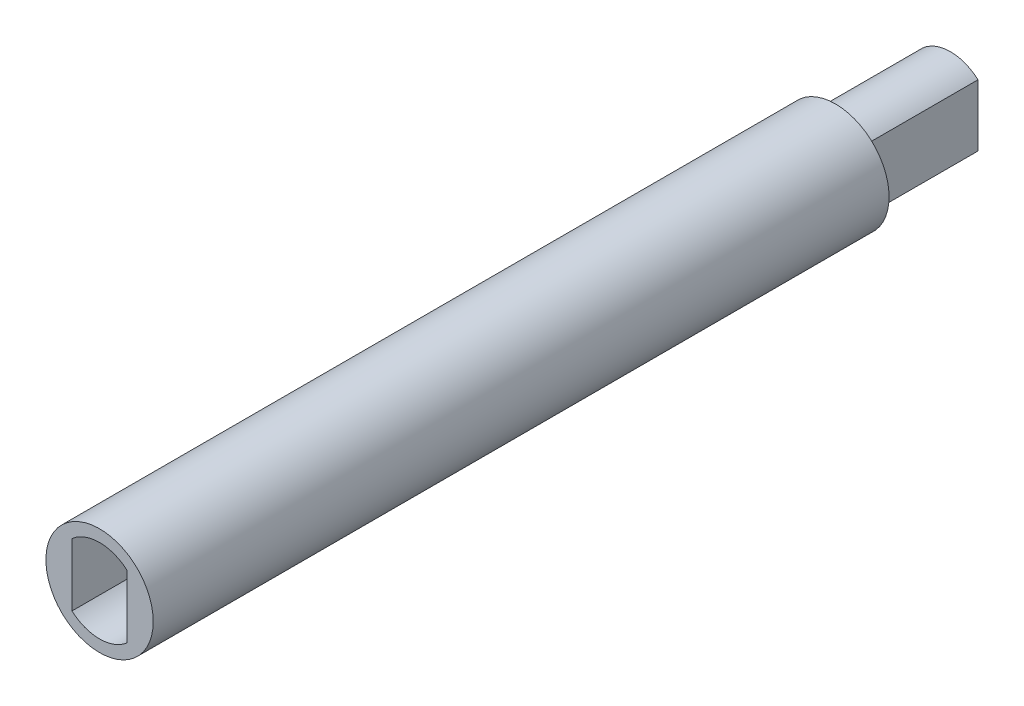
ISO-10303-21;
HEADER;
FILE_DESCRIPTION(('STEP AP214'),'2;1');
FILE_NAME('part.step','',(''),(''),'','','');
FILE_SCHEMA(('AUTOMOTIVE_DESIGN { 1 0 10303 214 1 1 1 1 }'));
ENDSEC;
DATA;
#1=APPLICATION_CONTEXT('core data for automotive mechanical design processes');
#2=APPLICATION_PROTOCOL_DEFINITION('international standard','automotive_design',2000,#1);
#3=PRODUCT_CONTEXT('',#1,'mechanical');
#4=PRODUCT('Part','Part','',(#3));
#5=PRODUCT_RELATED_PRODUCT_CATEGORY('part','',(#4));
#6=PRODUCT_DEFINITION_FORMATION('','',#4);
#7=PRODUCT_DEFINITION_CONTEXT('part definition',#1,'design');
#8=PRODUCT_DEFINITION('design','',#6,#7);
#9=PRODUCT_DEFINITION_SHAPE('','',#8);
#10=(LENGTH_UNIT() NAMED_UNIT(*) SI_UNIT(.MILLI.,.METRE.));
#11=(NAMED_UNIT(*) PLANE_ANGLE_UNIT() SI_UNIT($,.RADIAN.));
#12=(NAMED_UNIT(*) SI_UNIT($,.STERADIAN.) SOLID_ANGLE_UNIT());
#13=UNCERTAINTY_MEASURE_WITH_UNIT(LENGTH_MEASURE(1.E-05),#10,'distance_accuracy_value','');
#14=(GEOMETRIC_REPRESENTATION_CONTEXT(3) GLOBAL_UNCERTAINTY_ASSIGNED_CONTEXT((#13)) GLOBAL_UNIT_ASSIGNED_CONTEXT((#10,
#11,#12)) REPRESENTATION_CONTEXT('',''));
#15=CARTESIAN_POINT('',(0.,0.,0.));
#16=DIRECTION('',(0.,0.,1.));
#17=DIRECTION('',(1.,0.,0.));
#18=AXIS2_PLACEMENT_3D('',#15,#16,#17);
#19=CARTESIAN_POINT('',(-1.8,0.,-45.5));
#20=DIRECTION('',(1.,0.,0.));
#21=DIRECTION('',(0.,0.,-1.));
#22=AXIS2_PLACEMENT_3D('',#19,#20,#21);
#23=PLANE('',#22);
#24=DIRECTION('',(0.,1.,0.));
#25=VECTOR('',#24,1.);
#26=CARTESIAN_POINT('',(-1.8,4.20472197600874,-53.));
#27=LINE('',#26,#25);
#28=CARTESIAN_POINT('',(-1.8,-2.01246117974981,-53.));
#29=VERTEX_POINT('',#28);
#30=CARTESIAN_POINT('',(-1.8,2.01246117974981,-53.));
#31=VERTEX_POINT('',#30);
#32=EDGE_CURVE('E131',#29,#31,#27,.T.);
#33=ORIENTED_EDGE('',*,*,#32,.F.);
#34=DIRECTION('',(0.,0.,-1.));
#35=VECTOR('',#34,1.);
#36=CARTESIAN_POINT('',(-1.8,-2.01246117974981,-45.5));
#37=LINE('',#36,#35);
#38=CARTESIAN_POINT('',(-1.8,-2.01246117974981,-45.5));
#39=VERTEX_POINT('',#38);
#40=EDGE_CURVE('E159',#39,#29,#37,.T.);
#41=ORIENTED_EDGE('',*,*,#40,.F.);
#42=DIRECTION('',(0.,-1.,0.));
#43=VECTOR('',#42,1.);
#44=CARTESIAN_POINT('',(-1.8,0.,-45.5));
#45=LINE('',#44,#43);
#46=CARTESIAN_POINT('',(-1.8,2.01246117974981,-45.5));
#47=VERTEX_POINT('',#46);
#48=EDGE_CURVE('E136',#47,#39,#45,.T.);
#49=ORIENTED_EDGE('',*,*,#48,.F.);
#50=DIRECTION('',(0.,0.,-1.));
#51=VECTOR('',#50,1.);
#52=CARTESIAN_POINT('',(-1.8,2.01246117974981,-45.5));
#53=LINE('',#52,#51);
#54=EDGE_CURVE('E148',#47,#31,#53,.T.);
#55=ORIENTED_EDGE('',*,*,#54,.T.);
#56=EDGE_LOOP('',(#33,#41,#49,#55));
#57=FACE_BOUND('',#56,.T.);
#58=ADVANCED_FACE('F39',(#57),#23,.F.);
#59=CARTESIAN_POINT('',(0.,0.,-65.5));
#60=DIRECTION('',(0.,0.,1.));
#61=DIRECTION('',(1.,0.,0.));
#62=AXIS2_PLACEMENT_3D('',#59,#60,#61);
#63=CYLINDRICAL_SURFACE('',#62,3.5);
#64=CARTESIAN_POINT('',(0.,0.,-45.5));
#65=DIRECTION('',(0.,0.,-1.));
#66=DIRECTION('',(-1.,0.,0.));
#67=AXIS2_PLACEMENT_3D('',#64,#65,#66);
#68=CIRCLE('',#67,3.5);
#69=CARTESIAN_POINT('',(-3.5,0.,-45.5));
#70=VERTEX_POINT('',#69);
#71=EDGE_CURVE('E149',#70,#70,#68,.T.);
#72=ORIENTED_EDGE('',*,*,#71,.F.);
#73=EDGE_LOOP('',(#72));
#74=FACE_BOUND('',#73,.T.);
#75=CARTESIAN_POINT('',(0.,0.,2.5));
#76=DIRECTION('',(0.,0.,1.));
#77=DIRECTION('',(1.,0.,0.));
#78=AXIS2_PLACEMENT_3D('',#75,#76,#77);
#79=CIRCLE('',#78,3.5);
#80=CARTESIAN_POINT('',(3.5,0.,2.5));
#81=VERTEX_POINT('',#80);
#82=EDGE_CURVE('E130',#81,#81,#79,.T.);
#83=ORIENTED_EDGE('',*,*,#82,.F.);
#84=EDGE_LOOP('',(#83));
#85=FACE_BOUND('',#84,.T.);
#86=ADVANCED_FACE('F41',(#74,#85),#63,.T.);
#87=CARTESIAN_POINT('',(0.,0.,-45.5));
#88=DIRECTION('',(0.,0.,-1.));
#89=DIRECTION('',(-1.,0.,0.));
#90=AXIS2_PLACEMENT_3D('',#87,#88,#89);
#91=CYLINDRICAL_SURFACE('',#90,2.7);
#92=CARTESIAN_POINT('',(0.,0.,-53.));
#93=DIRECTION('',(0.,0.,1.));
#94=DIRECTION('',(1.,0.,0.));
#95=AXIS2_PLACEMENT_3D('',#92,#93,#94);
#96=CIRCLE('',#95,2.7);
#97=CARTESIAN_POINT('',(1.8,2.01246117974981,-53.));
#98=VERTEX_POINT('',#97);
#99=EDGE_CURVE('E132',#31,#98,#96,.F.);
#100=ORIENTED_EDGE('',*,*,#99,.F.);
#101=ORIENTED_EDGE('',*,*,#54,.F.);
#102=CARTESIAN_POINT('',(0.,0.,-45.5));
#103=DIRECTION('',(0.,0.,-1.));
#104=DIRECTION('',(-1.,0.,0.));
#105=AXIS2_PLACEMENT_3D('',#102,#103,#104);
#106=CIRCLE('',#105,2.7);
#107=CARTESIAN_POINT('',(1.8,2.01246117974981,-45.5));
#108=VERTEX_POINT('',#107);
#109=EDGE_CURVE('E137',#47,#108,#106,.T.);
#110=ORIENTED_EDGE('',*,*,#109,.T.);
#111=DIRECTION('',(0.,0.,-1.));
#112=VECTOR('',#111,1.);
#113=CARTESIAN_POINT('',(1.8,2.01246117974981,-45.5));
#114=LINE('',#113,#112);
#115=EDGE_CURVE('E147',#108,#98,#114,.T.);
#116=ORIENTED_EDGE('',*,*,#115,.T.);
#117=EDGE_LOOP('',(#100,#101,#110,#116));
#118=FACE_BOUND('',#117,.T.);
#119=ADVANCED_FACE('F197',(#118),#91,.T.);
#120=CARTESIAN_POINT('',(1.8,0.,-45.5));
#121=DIRECTION('',(1.,0.,0.));
#122=DIRECTION('',(0.,0.,-1.));
#123=AXIS2_PLACEMENT_3D('',#120,#121,#122);
#124=PLANE('',#123);
#125=DIRECTION('',(0.,-1.,0.));
#126=VECTOR('',#125,1.);
#127=CARTESIAN_POINT('',(1.8,0.,-53.));
#128=LINE('',#127,#126);
#129=CARTESIAN_POINT('',(1.8,-2.01246117974981,-53.));
#130=VERTEX_POINT('',#129);
#131=EDGE_CURVE('E52',#98,#130,#128,.T.);
#132=ORIENTED_EDGE('',*,*,#131,.F.);
#133=ORIENTED_EDGE('',*,*,#115,.F.);
#134=DIRECTION('',(0.,-1.,0.));
#135=VECTOR('',#134,1.);
#136=CARTESIAN_POINT('',(1.8,0.,-45.5));
#137=LINE('',#136,#135);
#138=CARTESIAN_POINT('',(1.8,-2.01246117974981,-45.5));
#139=VERTEX_POINT('',#138);
#140=EDGE_CURVE('E144',#108,#139,#137,.T.);
#141=ORIENTED_EDGE('',*,*,#140,.T.);
#142=DIRECTION('',(0.,0.,-1.));
#143=VECTOR('',#142,1.);
#144=CARTESIAN_POINT('',(1.8,-2.01246117974981,-45.5));
#145=LINE('',#144,#143);
#146=EDGE_CURVE('E152',#139,#130,#145,.T.);
#147=ORIENTED_EDGE('',*,*,#146,.T.);
#148=EDGE_LOOP('',(#132,#133,#141,#147));
#149=FACE_BOUND('',#148,.T.);
#150=ADVANCED_FACE('F203',(#149),#124,.T.);
#151=CARTESIAN_POINT('',(0.,0.,-45.5));
#152=DIRECTION('',(0.,0.,-1.));
#153=DIRECTION('',(-1.,0.,0.));
#154=AXIS2_PLACEMENT_3D('',#151,#152,#153);
#155=CYLINDRICAL_SURFACE('',#154,2.7);
#156=CARTESIAN_POINT('',(0.,0.,-53.));
#157=DIRECTION('',(0.,0.,1.));
#158=DIRECTION('',(1.,0.,0.));
#159=AXIS2_PLACEMENT_3D('',#156,#157,#158);
#160=CIRCLE('',#159,2.7);
#161=EDGE_CURVE('E11',#130,#29,#160,.F.);
#162=ORIENTED_EDGE('',*,*,#161,.F.);
#163=ORIENTED_EDGE('',*,*,#146,.F.);
#164=CARTESIAN_POINT('',(0.,0.,-45.5));
#165=DIRECTION('',(0.,0.,-1.));
#166=DIRECTION('',(-1.,0.,0.));
#167=AXIS2_PLACEMENT_3D('',#164,#165,#166);
#168=CIRCLE('',#167,2.7);
#169=EDGE_CURVE('E145',#139,#39,#168,.T.);
#170=ORIENTED_EDGE('',*,*,#169,.T.);
#171=ORIENTED_EDGE('',*,*,#40,.T.);
#172=EDGE_LOOP('',(#162,#163,#170,#171));
#173=FACE_BOUND('',#172,.T.);
#174=ADVANCED_FACE('F205',(#173),#155,.T.);
#175=CARTESIAN_POINT('',(0.,0.,-45.5));
#176=DIRECTION('',(0.,0.,-1.));
#177=DIRECTION('',(-1.,0.,0.));
#178=AXIS2_PLACEMENT_3D('',#175,#176,#177);
#179=PLANE('',#178);
#180=ORIENTED_EDGE('',*,*,#109,.F.);
#181=ORIENTED_EDGE('',*,*,#48,.T.);
#182=ORIENTED_EDGE('',*,*,#169,.F.);
#183=ORIENTED_EDGE('',*,*,#140,.F.);
#184=EDGE_LOOP('',(#180,#181,#182,#183));
#185=FACE_BOUND('',#184,.T.);
#186=ORIENTED_EDGE('',*,*,#71,.T.);
#187=EDGE_LOOP('',(#186));
#188=FACE_BOUND('',#187,.T.);
#189=ADVANCED_FACE('F218',(#185,#188),#179,.T.);
#190=CARTESIAN_POINT('',(8.2,4.20472197600874,-53.));
#191=DIRECTION('',(0.,0.,1.));
#192=DIRECTION('',(1.,0.,0.));
#193=AXIS2_PLACEMENT_3D('',#190,#191,#192);
#194=PLANE('',#193);
#195=ORIENTED_EDGE('',*,*,#99,.T.);
#196=ORIENTED_EDGE('',*,*,#131,.T.);
#197=ORIENTED_EDGE('',*,*,#161,.T.);
#198=ORIENTED_EDGE('',*,*,#32,.T.);
#199=EDGE_LOOP('',(#195,#196,#197,#198));
#200=FACE_BOUND('',#199,.T.);
#201=ADVANCED_FACE('F190',(#200),#194,.F.);
#202=CARTESIAN_POINT('',(0.,0.,2.5));
#203=DIRECTION('',(0.,0.,1.));
#204=DIRECTION('',(1.,0.,0.));
#205=AXIS2_PLACEMENT_3D('',#202,#203,#204);
#206=PLANE('',#205);
#207=ORIENTED_EDGE('',*,*,#82,.T.);
#208=EDGE_LOOP('',(#207));
#209=FACE_BOUND('',#208,.T.);
#210=DIRECTION('',(0.,-1.,0.));
#211=VECTOR('',#210,1.);
#212=CARTESIAN_POINT('',(-1.8,2.04588000625648,2.5));
#213=LINE('',#212,#211);
#214=CARTESIAN_POINT('',(-1.8,2.04588000625648,2.5));
#215=VERTEX_POINT('',#214);
#216=CARTESIAN_POINT('',(-1.8,-2.04588000625648,2.5));
#217=VERTEX_POINT('',#216);
#218=EDGE_CURVE('E104',#215,#217,#213,.T.);
#219=ORIENTED_EDGE('',*,*,#218,.F.);
#220=CARTESIAN_POINT('',(0.,0.,2.5));
#221=DIRECTION('',(0.,0.,1.));
#222=DIRECTION('',(1.,0.,0.));
#223=AXIS2_PLACEMENT_3D('',#220,#221,#222);
#224=CIRCLE('',#223,2.725);
#225=CARTESIAN_POINT('',(1.8,2.04588000625648,2.5));
#226=VERTEX_POINT('',#225);
#227=EDGE_CURVE('E112',#226,#215,#224,.T.);
#228=ORIENTED_EDGE('',*,*,#227,.F.);
#229=DIRECTION('',(0.,1.,0.));
#230=VECTOR('',#229,1.);
#231=CARTESIAN_POINT('',(1.8,2.04588000625648,2.5));
#232=LINE('',#231,#230);
#233=CARTESIAN_POINT('',(1.8,-2.04588000625648,2.5));
#234=VERTEX_POINT('',#233);
#235=EDGE_CURVE('E121',#234,#226,#232,.T.);
#236=ORIENTED_EDGE('',*,*,#235,.F.);
#237=CARTESIAN_POINT('',(0.,0.,2.5));
#238=DIRECTION('',(0.,0.,1.));
#239=DIRECTION('',(1.,0.,0.));
#240=AXIS2_PLACEMENT_3D('',#237,#238,#239);
#241=CIRCLE('',#240,2.725);
#242=EDGE_CURVE('E125',#217,#234,#241,.T.);
#243=ORIENTED_EDGE('',*,*,#242,.F.);
#244=EDGE_LOOP('',(#219,#228,#236,#243));
#245=FACE_BOUND('',#244,.T.);
#246=ADVANCED_FACE('F119',(#209,#245),#206,.T.);
#247=CARTESIAN_POINT('',(0.,0.,-8.));
#248=DIRECTION('',(0.,0.,1.));
#249=DIRECTION('',(1.,0.,0.));
#250=AXIS2_PLACEMENT_3D('',#247,#248,#249);
#251=PLANE('',#250);
#252=CARTESIAN_POINT('',(0.,0.,-8.));
#253=DIRECTION('',(0.,0.,1.));
#254=DIRECTION('',(1.,0.,0.));
#255=AXIS2_PLACEMENT_3D('',#252,#253,#254);
#256=CIRCLE('',#255,2.725);
#257=CARTESIAN_POINT('',(-1.8,-2.04588000625648,-8.));
#258=VERTEX_POINT('',#257);
#259=CARTESIAN_POINT('',(1.8,-2.04588000625648,-8.));
#260=VERTEX_POINT('',#259);
#261=EDGE_CURVE('E153',#258,#260,#256,.T.);
#262=ORIENTED_EDGE('',*,*,#261,.T.);
#263=DIRECTION('',(0.,1.,0.));
#264=VECTOR('',#263,1.);
#265=CARTESIAN_POINT('',(1.8,2.04588000625648,-8.));
#266=LINE('',#265,#264);
#267=CARTESIAN_POINT('',(1.8,2.04588000625648,-8.));
#268=VERTEX_POINT('',#267);
#269=EDGE_CURVE('E165',#260,#268,#266,.T.);
#270=ORIENTED_EDGE('',*,*,#269,.T.);
#271=CARTESIAN_POINT('',(0.,0.,-8.));
#272=DIRECTION('',(0.,0.,1.));
#273=DIRECTION('',(1.,0.,0.));
#274=AXIS2_PLACEMENT_3D('',#271,#272,#273);
#275=CIRCLE('',#274,2.725);
#276=CARTESIAN_POINT('',(-1.8,2.04588000625648,-8.));
#277=VERTEX_POINT('',#276);
#278=EDGE_CURVE('E170',#268,#277,#275,.T.);
#279=ORIENTED_EDGE('',*,*,#278,.T.);
#280=DIRECTION('',(0.,-1.,0.));
#281=VECTOR('',#280,1.);
#282=CARTESIAN_POINT('',(-1.8,2.04588000625648,-8.));
#283=LINE('',#282,#281);
#284=EDGE_CURVE('E110',#277,#258,#283,.T.);
#285=ORIENTED_EDGE('',*,*,#284,.T.);
#286=EDGE_LOOP('',(#262,#270,#279,#285));
#287=FACE_BOUND('',#286,.T.);
#288=ADVANCED_FACE('F178',(#287),#251,.T.);
#289=CARTESIAN_POINT('',(1.8,2.04588000625648,-8.));
#290=DIRECTION('',(1.,0.,0.));
#291=DIRECTION('',(0.,0.,-1.));
#292=AXIS2_PLACEMENT_3D('',#289,#290,#291);
#293=PLANE('',#292);
#294=DIRECTION('',(0.,0.,1.));
#295=VECTOR('',#294,1.);
#296=CARTESIAN_POINT('',(1.8,-2.04588000625648,-8.));
#297=LINE('',#296,#295);
#298=EDGE_CURVE('E167',#260,#234,#297,.T.);
#299=ORIENTED_EDGE('',*,*,#298,.T.);
#300=ORIENTED_EDGE('',*,*,#235,.T.);
#301=DIRECTION('',(0.,0.,1.));
#302=VECTOR('',#301,1.);
#303=CARTESIAN_POINT('',(1.8,2.04588000625648,-8.));
#304=LINE('',#303,#302);
#305=EDGE_CURVE('E111',#268,#226,#304,.T.);
#306=ORIENTED_EDGE('',*,*,#305,.F.);
#307=ORIENTED_EDGE('',*,*,#269,.F.);
#308=EDGE_LOOP('',(#299,#300,#306,#307));
#309=FACE_BOUND('',#308,.T.);
#310=ADVANCED_FACE('F172',(#309),#293,.F.);
#311=CARTESIAN_POINT('',(0.,0.,-8.));
#312=DIRECTION('',(0.,0.,1.));
#313=DIRECTION('',(1.,0.,0.));
#314=AXIS2_PLACEMENT_3D('',#311,#312,#313);
#315=CYLINDRICAL_SURFACE('',#314,2.725);
#316=ORIENTED_EDGE('',*,*,#305,.T.);
#317=ORIENTED_EDGE('',*,*,#227,.T.);
#318=DIRECTION('',(0.,0.,1.));
#319=VECTOR('',#318,1.);
#320=CARTESIAN_POINT('',(-1.8,2.04588000625648,-8.));
#321=LINE('',#320,#319);
#322=EDGE_CURVE('E99',#277,#215,#321,.T.);
#323=ORIENTED_EDGE('',*,*,#322,.F.);
#324=ORIENTED_EDGE('',*,*,#278,.F.);
#325=EDGE_LOOP('',(#316,#317,#323,#324));
#326=FACE_BOUND('',#325,.T.);
#327=ADVANCED_FACE('F114',(#326),#315,.F.);
#328=CARTESIAN_POINT('',(-1.8,2.04588000625648,-8.));
#329=DIRECTION('',(-1.,0.,0.));
#330=DIRECTION('',(0.,0.,1.));
#331=AXIS2_PLACEMENT_3D('',#328,#329,#330);
#332=PLANE('',#331);
#333=ORIENTED_EDGE('',*,*,#322,.T.);
#334=ORIENTED_EDGE('',*,*,#218,.T.);
#335=DIRECTION('',(0.,0.,1.));
#336=VECTOR('',#335,1.);
#337=CARTESIAN_POINT('',(-1.8,-2.04588000625648,-8.));
#338=LINE('',#337,#336);
#339=EDGE_CURVE('E50',#258,#217,#338,.T.);
#340=ORIENTED_EDGE('',*,*,#339,.F.);
#341=ORIENTED_EDGE('',*,*,#284,.F.);
#342=EDGE_LOOP('',(#333,#334,#340,#341));
#343=FACE_BOUND('',#342,.T.);
#344=ADVANCED_FACE('F105',(#343),#332,.F.);
#345=CARTESIAN_POINT('',(0.,0.,-8.));
#346=DIRECTION('',(0.,0.,1.));
#347=DIRECTION('',(1.,0.,0.));
#348=AXIS2_PLACEMENT_3D('',#345,#346,#347);
#349=CYLINDRICAL_SURFACE('',#348,2.725);
#350=ORIENTED_EDGE('',*,*,#339,.T.);
#351=ORIENTED_EDGE('',*,*,#242,.T.);
#352=ORIENTED_EDGE('',*,*,#298,.F.);
#353=ORIENTED_EDGE('',*,*,#261,.F.);
#354=EDGE_LOOP('',(#350,#351,#352,#353));
#355=FACE_BOUND('',#354,.T.);
#356=ADVANCED_FACE('F176',(#355),#349,.F.);
#357=CLOSED_SHELL('',(#58,#86,#119,#150,#174,#189,#201,#246,#288,#310,#327,#344,#356));
#358=MANIFOLD_SOLID_BREP('B2',#357);
#359=ADVANCED_BREP_SHAPE_REPRESENTATION('',(#18,#358),#14);
#360=SHAPE_DEFINITION_REPRESENTATION(#9,#359);
ENDSEC;
END-ISO-10303-21;
